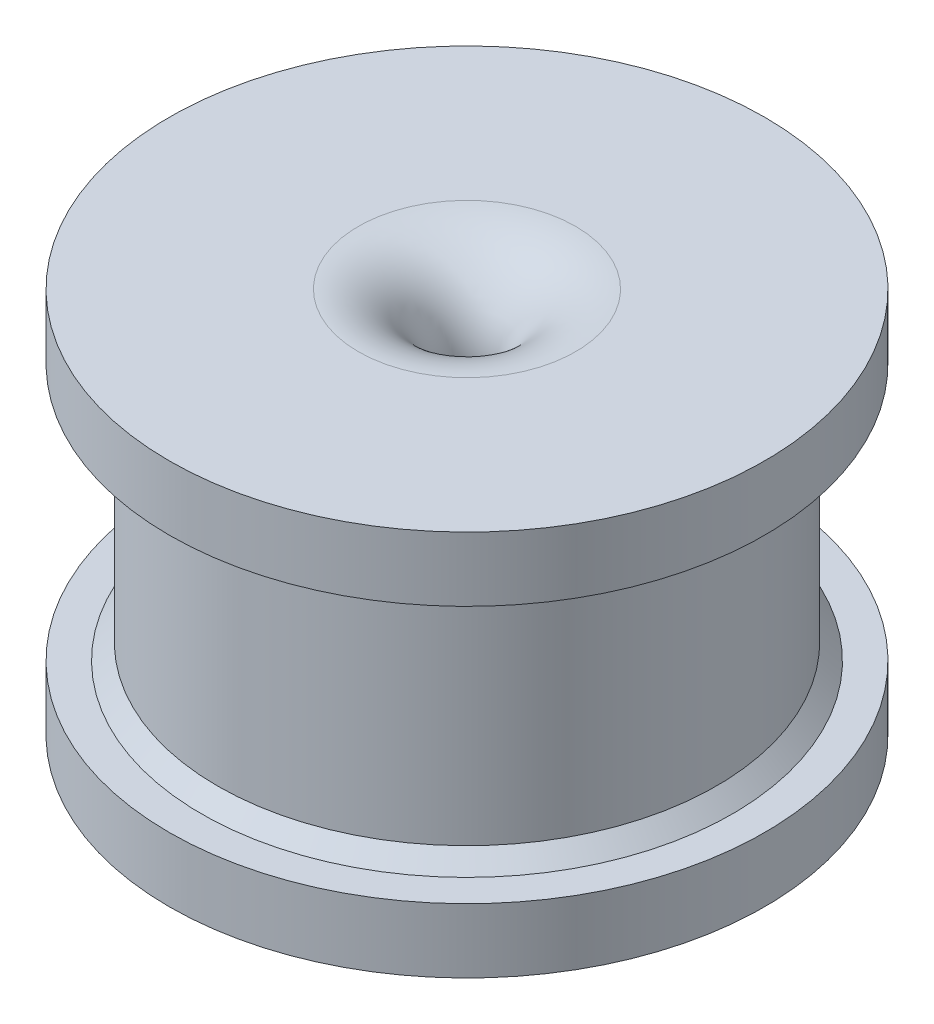
ISO-10303-21;
HEADER;
FILE_DESCRIPTION(('STEP AP214'),'2;1');
FILE_NAME('part.step','',(''),(''),'','','');
FILE_SCHEMA(('AUTOMOTIVE_DESIGN { 1 0 10303 214 1 1 1 1 }'));
ENDSEC;
DATA;
#1=APPLICATION_CONTEXT('core data for automotive mechanical design processes');
#2=APPLICATION_PROTOCOL_DEFINITION('international standard','automotive_design',2000,#1);
#3=PRODUCT_CONTEXT('',#1,'mechanical');
#4=PRODUCT('Part','Part','',(#3));
#5=PRODUCT_RELATED_PRODUCT_CATEGORY('part','',(#4));
#6=PRODUCT_DEFINITION_FORMATION('','',#4);
#7=PRODUCT_DEFINITION_CONTEXT('part definition',#1,'design');
#8=PRODUCT_DEFINITION('design','',#6,#7);
#9=PRODUCT_DEFINITION_SHAPE('','',#8);
#10=(LENGTH_UNIT() NAMED_UNIT(*) SI_UNIT(.MILLI.,.METRE.));
#11=(NAMED_UNIT(*) PLANE_ANGLE_UNIT() SI_UNIT($,.RADIAN.));
#12=(NAMED_UNIT(*) SI_UNIT($,.STERADIAN.) SOLID_ANGLE_UNIT());
#13=UNCERTAINTY_MEASURE_WITH_UNIT(LENGTH_MEASURE(1.E-05),#10,'distance_accuracy_value','');
#14=(GEOMETRIC_REPRESENTATION_CONTEXT(3) GLOBAL_UNCERTAINTY_ASSIGNED_CONTEXT((#13)) GLOBAL_UNIT_ASSIGNED_CONTEXT((#10,
#11,#12)) REPRESENTATION_CONTEXT('',''));
#15=CARTESIAN_POINT('',(0.,0.,0.));
#16=DIRECTION('',(0.,0.,1.));
#17=DIRECTION('',(1.,0.,0.));
#18=AXIS2_PLACEMENT_3D('',#15,#16,#17);
#19=CARTESIAN_POINT('',(0.,16.,0.));
#20=DIRECTION('',(0.,-1.,0.));
#21=DIRECTION('',(0.,0.,-1.));
#22=AXIS2_PLACEMENT_3D('',#19,#20,#21);
#23=CYLINDRICAL_SURFACE('',#22,15.5);
#24=CARTESIAN_POINT('',(0.,15.,0.));
#25=DIRECTION('',(0.,1.,0.));
#26=DIRECTION('',(0.,0.,1.));
#27=AXIS2_PLACEMENT_3D('',#24,#25,#26);
#28=CIRCLE('',#27,15.5);
#29=CARTESIAN_POINT('',(0.,15.,15.5));
#30=VERTEX_POINT('',#29);
#31=EDGE_CURVE('E52',#30,#30,#28,.F.);
#32=ORIENTED_EDGE('',*,*,#31,.T.);
#33=EDGE_LOOP('',(#32));
#34=FACE_BOUND('',#33,.T.);
#35=CARTESIAN_POINT('',(0.,1.00000000000002,0.));
#36=DIRECTION('',(0.,-1.,0.));
#37=DIRECTION('',(0.,0.,-1.));
#38=AXIS2_PLACEMENT_3D('',#35,#36,#37);
#39=CIRCLE('',#38,15.5);
#40=CARTESIAN_POINT('',(0.,1.00000000000002,-15.5));
#41=VERTEX_POINT('',#40);
#42=EDGE_CURVE('E57',#41,#41,#39,.F.);
#43=ORIENTED_EDGE('',*,*,#42,.T.);
#44=EDGE_LOOP('',(#43));
#45=FACE_BOUND('',#44,.T.);
#46=ADVANCED_FACE('F43',(#34,#45),#23,.T.);
#47=CARTESIAN_POINT('',(0.,16.,0.));
#48=DIRECTION('',(0.,-1.,0.));
#49=DIRECTION('',(0.,0.,-1.));
#50=AXIS2_PLACEMENT_3D('',#47,#48,#49);
#51=CYLINDRICAL_SURFACE('',#50,1.75);
#52=CARTESIAN_POINT('',(0.,1.,0.));
#53=DIRECTION('',(0.,-1.,0.));
#54=DIRECTION('',(0.,0.,-1.));
#55=AXIS2_PLACEMENT_3D('',#52,#53,#54);
#56=CIRCLE('',#55,1.75);
#57=CARTESIAN_POINT('',(0.,1.,-1.75));
#58=VERTEX_POINT('',#57);
#59=EDGE_CURVE('E76',#58,#58,#56,.T.);
#60=ORIENTED_EDGE('',*,*,#59,.T.);
#61=EDGE_LOOP('',(#60));
#62=FACE_BOUND('',#61,.T.);
#63=CARTESIAN_POINT('',(0.,15.,0.));
#64=DIRECTION('',(0.,1.,0.));
#65=DIRECTION('',(0.,0.,1.));
#66=AXIS2_PLACEMENT_3D('',#63,#64,#65);
#67=CIRCLE('',#66,1.75);
#68=CARTESIAN_POINT('',(0.,15.,1.75));
#69=VERTEX_POINT('',#68);
#70=EDGE_CURVE('E80',#69,#69,#67,.T.);
#71=ORIENTED_EDGE('',*,*,#70,.T.);
#72=EDGE_LOOP('',(#71));
#73=FACE_BOUND('',#72,.T.);
#74=ADVANCED_FACE('F120',(#62,#73),#51,.F.);
#75=CARTESIAN_POINT('',(0.,20.,0.));
#76=DIRECTION('',(0.,1.,0.));
#77=DIRECTION('',(0.,0.,1.));
#78=AXIS2_PLACEMENT_3D('',#75,#76,#77);
#79=PLANE('',#78);
#80=CARTESIAN_POINT('',(0.,20.,0.));
#81=DIRECTION('',(0.,1.,0.));
#82=DIRECTION('',(0.,0.,1.));
#83=AXIS2_PLACEMENT_3D('',#80,#81,#82);
#84=CIRCLE('',#83,6.75);
#85=CARTESIAN_POINT('',(0.,20.,6.75));
#86=VERTEX_POINT('',#85);
#87=EDGE_CURVE('E68',#86,#86,#84,.F.);
#88=ORIENTED_EDGE('',*,*,#87,.T.);
#89=EDGE_LOOP('',(#88));
#90=FACE_BOUND('',#89,.T.);
#91=CARTESIAN_POINT('',(0.,20.,0.));
#92=DIRECTION('',(0.,1.,0.));
#93=DIRECTION('',(0.,0.,1.));
#94=AXIS2_PLACEMENT_3D('',#91,#92,#93);
#95=CIRCLE('',#94,18.5);
#96=CARTESIAN_POINT('',(0.,20.,18.5));
#97=VERTEX_POINT('',#96);
#98=EDGE_CURVE('E84',#97,#97,#95,.T.);
#99=ORIENTED_EDGE('',*,*,#98,.T.);
#100=EDGE_LOOP('',(#99));
#101=FACE_BOUND('',#100,.T.);
#102=ADVANCED_FACE('F125',(#90,#101),#79,.T.);
#103=CARTESIAN_POINT('',(0.,16.,0.));
#104=DIRECTION('',(0.,1.,0.));
#105=DIRECTION('',(0.,0.,1.));
#106=AXIS2_PLACEMENT_3D('',#103,#104,#105);
#107=PLANE('',#106);
#108=CARTESIAN_POINT('',(0.,16.,0.));
#109=DIRECTION('',(0.,1.,0.));
#110=DIRECTION('',(0.,0.,1.));
#111=AXIS2_PLACEMENT_3D('',#108,#109,#110);
#112=CIRCLE('',#111,16.5);
#113=CARTESIAN_POINT('',(0.,16.,16.5));
#114=VERTEX_POINT('',#113);
#115=EDGE_CURVE('E62',#114,#114,#112,.T.);
#116=ORIENTED_EDGE('',*,*,#115,.T.);
#117=EDGE_LOOP('',(#116));
#118=FACE_BOUND('',#117,.T.);
#119=CARTESIAN_POINT('',(0.,16.,0.));
#120=DIRECTION('',(0.,1.,0.));
#121=DIRECTION('',(0.,0.,1.));
#122=AXIS2_PLACEMENT_3D('',#119,#120,#121);
#123=CIRCLE('',#122,18.5);
#124=CARTESIAN_POINT('',(0.,16.,18.5));
#125=VERTEX_POINT('',#124);
#126=EDGE_CURVE('E85',#125,#125,#123,.T.);
#127=ORIENTED_EDGE('',*,*,#126,.F.);
#128=EDGE_LOOP('',(#127));
#129=FACE_BOUND('',#128,.T.);
#130=ADVANCED_FACE('F150',(#118,#129),#107,.F.);
#131=CARTESIAN_POINT('',(0.,20.,0.));
#132=DIRECTION('',(0.,-1.,0.));
#133=DIRECTION('',(0.,0.,-1.));
#134=AXIS2_PLACEMENT_3D('',#131,#132,#133);
#135=CYLINDRICAL_SURFACE('',#134,18.5);
#136=ORIENTED_EDGE('',*,*,#98,.F.);
#137=EDGE_LOOP('',(#136));
#138=FACE_BOUND('',#137,.T.);
#139=ORIENTED_EDGE('',*,*,#126,.T.);
#140=EDGE_LOOP('',(#139));
#141=FACE_BOUND('',#140,.T.);
#142=ADVANCED_FACE('F116',(#138,#141),#135,.T.);
#143=CARTESIAN_POINT('',(0.,-4.,0.));
#144=DIRECTION('',(0.,-1.,0.));
#145=DIRECTION('',(0.,0.,-1.));
#146=AXIS2_PLACEMENT_3D('',#143,#144,#145);
#147=PLANE('',#146);
#148=CARTESIAN_POINT('',(0.,-4.,0.));
#149=DIRECTION('',(0.,-1.,0.));
#150=DIRECTION('',(0.,0.,-1.));
#151=AXIS2_PLACEMENT_3D('',#148,#149,#150);
#152=CIRCLE('',#151,6.75);
#153=CARTESIAN_POINT('',(0.,-4.,-6.75));
#154=VERTEX_POINT('',#153);
#155=EDGE_CURVE('E72',#154,#154,#152,.F.);
#156=ORIENTED_EDGE('',*,*,#155,.T.);
#157=EDGE_LOOP('',(#156));
#158=FACE_BOUND('',#157,.T.);
#159=CARTESIAN_POINT('',(0.,-4.,0.));
#160=DIRECTION('',(0.,-1.,0.));
#161=DIRECTION('',(0.,0.,-1.));
#162=AXIS2_PLACEMENT_3D('',#159,#160,#161);
#163=CIRCLE('',#162,18.5);
#164=CARTESIAN_POINT('',(0.,-4.,-18.5));
#165=VERTEX_POINT('',#164);
#166=EDGE_CURVE('E89',#165,#165,#163,.T.);
#167=ORIENTED_EDGE('',*,*,#166,.T.);
#168=EDGE_LOOP('',(#167));
#169=FACE_BOUND('',#168,.T.);
#170=ADVANCED_FACE('F101',(#158,#169),#147,.T.);
#171=CARTESIAN_POINT('',(0.,0.,0.));
#172=DIRECTION('',(0.,-1.,0.));
#173=DIRECTION('',(0.,0.,-1.));
#174=AXIS2_PLACEMENT_3D('',#171,#172,#173);
#175=PLANE('',#174);
#176=CARTESIAN_POINT('',(0.,0.,0.));
#177=DIRECTION('',(0.,-1.,0.));
#178=DIRECTION('',(0.,0.,-1.));
#179=AXIS2_PLACEMENT_3D('',#176,#177,#178);
#180=CIRCLE('',#179,16.5);
#181=CARTESIAN_POINT('',(0.,0.,-16.5));
#182=VERTEX_POINT('',#181);
#183=EDGE_CURVE('E10',#182,#182,#180,.T.);
#184=ORIENTED_EDGE('',*,*,#183,.T.);
#185=EDGE_LOOP('',(#184));
#186=FACE_BOUND('',#185,.T.);
#187=CARTESIAN_POINT('',(0.,0.,0.));
#188=DIRECTION('',(0.,-1.,0.));
#189=DIRECTION('',(0.,0.,-1.));
#190=AXIS2_PLACEMENT_3D('',#187,#188,#189);
#191=CIRCLE('',#190,18.5);
#192=CARTESIAN_POINT('',(0.,0.,-18.5));
#193=VERTEX_POINT('',#192);
#194=EDGE_CURVE('E93',#193,#193,#191,.T.);
#195=ORIENTED_EDGE('',*,*,#194,.F.);
#196=EDGE_LOOP('',(#195));
#197=FACE_BOUND('',#196,.T.);
#198=ADVANCED_FACE('F107',(#186,#197),#175,.F.);
#199=CARTESIAN_POINT('',(0.,-4.,0.));
#200=DIRECTION('',(0.,1.,0.));
#201=DIRECTION('',(0.,0.,1.));
#202=AXIS2_PLACEMENT_3D('',#199,#200,#201);
#203=CYLINDRICAL_SURFACE('',#202,18.5);
#204=ORIENTED_EDGE('',*,*,#166,.F.);
#205=EDGE_LOOP('',(#204));
#206=FACE_BOUND('',#205,.T.);
#207=ORIENTED_EDGE('',*,*,#194,.T.);
#208=EDGE_LOOP('',(#207));
#209=FACE_BOUND('',#208,.T.);
#210=ADVANCED_FACE('F103',(#206,#209),#203,.T.);
#211=CARTESIAN_POINT('',(0.,1.,0.));
#212=DIRECTION('',(0.,-1.,0.));
#213=DIRECTION('',(0.,0.,-1.));
#214=AXIS2_PLACEMENT_3D('',#211,#212,#213);
#215=TOROIDAL_SURFACE('',#214,6.75,5.);
#216=ORIENTED_EDGE('',*,*,#155,.F.);
#217=EDGE_LOOP('',(#216));
#218=FACE_BOUND('',#217,.T.);
#219=ORIENTED_EDGE('',*,*,#59,.F.);
#220=EDGE_LOOP('',(#219));
#221=FACE_BOUND('',#220,.T.);
#222=ADVANCED_FACE('F106',(#218,#221),#215,.T.);
#223=CARTESIAN_POINT('',(0.,15.,0.));
#224=DIRECTION('',(0.,1.,0.));
#225=DIRECTION('',(0.,0.,1.));
#226=AXIS2_PLACEMENT_3D('',#223,#224,#225);
#227=TOROIDAL_SURFACE('',#226,6.75,5.);
#228=ORIENTED_EDGE('',*,*,#87,.F.);
#229=EDGE_LOOP('',(#228));
#230=FACE_BOUND('',#229,.T.);
#231=ORIENTED_EDGE('',*,*,#70,.F.);
#232=EDGE_LOOP('',(#231));
#233=FACE_BOUND('',#232,.T.);
#234=ADVANCED_FACE('F133',(#230,#233),#227,.T.);
#235=CARTESIAN_POINT('',(0.,16.,0.));
#236=DIRECTION('',(0.,1.,0.));
#237=DIRECTION('',(0.,0.,1.));
#238=AXIS2_PLACEMENT_3D('',#235,#236,#237);
#239=CONICAL_SURFACE('',#238,16.5,0.785398163397451);
#240=ORIENTED_EDGE('',*,*,#31,.F.);
#241=EDGE_LOOP('',(#240));
#242=FACE_BOUND('',#241,.T.);
#243=ORIENTED_EDGE('',*,*,#115,.F.);
#244=EDGE_LOOP('',(#243));
#245=FACE_BOUND('',#244,.T.);
#246=ADVANCED_FACE('F136',(#242,#245),#239,.T.);
#247=CARTESIAN_POINT('',(0.,1.00000000000002,0.));
#248=DIRECTION('',(0.,-1.,0.));
#249=DIRECTION('',(0.,0.,-1.));
#250=AXIS2_PLACEMENT_3D('',#247,#248,#249);
#251=CONICAL_SURFACE('',#250,15.5,0.785398163397446);
#252=ORIENTED_EDGE('',*,*,#183,.F.);
#253=EDGE_LOOP('',(#252));
#254=FACE_BOUND('',#253,.T.);
#255=ORIENTED_EDGE('',*,*,#42,.F.);
#256=EDGE_LOOP('',(#255));
#257=FACE_BOUND('',#256,.T.);
#258=ADVANCED_FACE('F46',(#254,#257),#251,.T.);
#259=CLOSED_SHELL('',(#46,#74,#102,#130,#142,#170,#198,#210,#222,#234,#246,#258));
#260=MANIFOLD_SOLID_BREP('B2',#259);
#261=ADVANCED_BREP_SHAPE_REPRESENTATION('',(#18,#260),#14);
#262=SHAPE_DEFINITION_REPRESENTATION(#9,#261);
ENDSEC;
END-ISO-10303-21;
